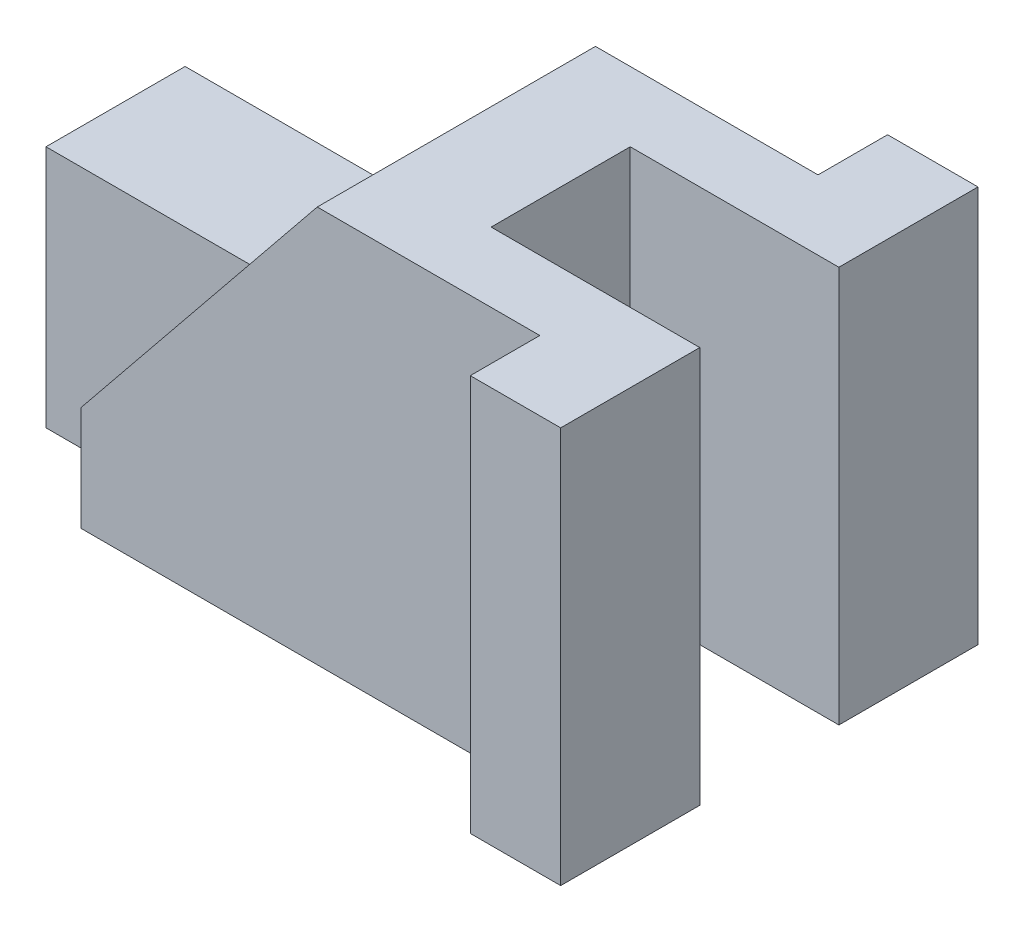
ISO-10303-21;
HEADER;
FILE_DESCRIPTION(('STEP AP214'),'2;1');
FILE_NAME('part.step','',(''),(''),'','','');
FILE_SCHEMA(('AUTOMOTIVE_DESIGN { 1 0 10303 214 1 1 1 1 }'));
ENDSEC;
DATA;
#1=APPLICATION_CONTEXT('core data for automotive mechanical design processes');
#2=APPLICATION_PROTOCOL_DEFINITION('international standard','automotive_design',2000,#1);
#3=PRODUCT_CONTEXT('',#1,'mechanical');
#4=PRODUCT('Part','Part','',(#3));
#5=PRODUCT_RELATED_PRODUCT_CATEGORY('part','',(#4));
#6=PRODUCT_DEFINITION_FORMATION('','',#4);
#7=PRODUCT_DEFINITION_CONTEXT('part definition',#1,'design');
#8=PRODUCT_DEFINITION('design','',#6,#7);
#9=PRODUCT_DEFINITION_SHAPE('','',#8);
#10=(LENGTH_UNIT() NAMED_UNIT(*) SI_UNIT(.MILLI.,.METRE.));
#11=(NAMED_UNIT(*) PLANE_ANGLE_UNIT() SI_UNIT($,.RADIAN.));
#12=(NAMED_UNIT(*) SI_UNIT($,.STERADIAN.) SOLID_ANGLE_UNIT());
#13=UNCERTAINTY_MEASURE_WITH_UNIT(LENGTH_MEASURE(1.E-05),#10,'distance_accuracy_value','');
#14=(GEOMETRIC_REPRESENTATION_CONTEXT(3) GLOBAL_UNCERTAINTY_ASSIGNED_CONTEXT((#13)) GLOBAL_UNIT_ASSIGNED_CONTEXT((#10,
#11,#12)) REPRESENTATION_CONTEXT('',''));
#15=CARTESIAN_POINT('',(0.,0.,0.));
#16=DIRECTION('',(0.,0.,1.));
#17=DIRECTION('',(1.,0.,0.));
#18=AXIS2_PLACEMENT_3D('',#15,#16,#17);
#19=CARTESIAN_POINT('',(0.,15.,20.));
#20=DIRECTION('',(1.,0.,0.));
#21=DIRECTION('',(0.,0.,-1.));
#22=AXIS2_PLACEMENT_3D('',#19,#20,#21);
#23=PLANE('',#22);
#24=DIRECTION('',(0.,1.,0.));
#25=VECTOR('',#24,1.);
#26=CARTESIAN_POINT('',(0.,0.,-10.));
#27=LINE('',#26,#25);
#28=CARTESIAN_POINT('',(0.,0.,-10.));
#29=VERTEX_POINT('',#28);
#30=CARTESIAN_POINT('',(0.,15.,-10.));
#31=VERTEX_POINT('',#30);
#32=EDGE_CURVE('E167',#29,#31,#27,.T.);
#33=ORIENTED_EDGE('',*,*,#32,.T.);
#34=DIRECTION('',(0.,0.,-1.));
#35=VECTOR('',#34,1.);
#36=CARTESIAN_POINT('',(0.,15.,20.));
#37=LINE('',#36,#35);
#38=CARTESIAN_POINT('',(0.,15.,-20.));
#39=VERTEX_POINT('',#38);
#40=EDGE_CURVE('E269',#31,#39,#37,.T.);
#41=ORIENTED_EDGE('',*,*,#40,.T.);
#42=DIRECTION('',(0.,-1.,0.));
#43=VECTOR('',#42,1.);
#44=CARTESIAN_POINT('',(0.,15.,-20.));
#45=LINE('',#44,#43);
#46=CARTESIAN_POINT('',(0.,0.,-20.));
#47=VERTEX_POINT('',#46);
#48=EDGE_CURVE('E254',#39,#47,#45,.T.);
#49=ORIENTED_EDGE('',*,*,#48,.T.);
#50=DIRECTION('',(0.,0.,-1.));
#51=VECTOR('',#50,1.);
#52=CARTESIAN_POINT('',(0.,0.,20.));
#53=LINE('',#52,#51);
#54=EDGE_CURVE('E40',#29,#47,#53,.T.);
#55=ORIENTED_EDGE('',*,*,#54,.F.);
#56=EDGE_LOOP('',(#33,#41,#49,#55));
#57=FACE_BOUND('',#56,.T.);
#58=ADVANCED_FACE('F33',(#57),#23,.F.);
#59=DIRECTION('',(0.,-1.,0.));
#60=VECTOR('',#59,1.);
#61=CARTESIAN_POINT('',(0.,0.,10.));
#62=LINE('',#61,#60);
#63=CARTESIAN_POINT('',(0.,15.,10.));
#64=VERTEX_POINT('',#63);
#65=CARTESIAN_POINT('',(0.,0.,10.));
#66=VERTEX_POINT('',#65);
#67=EDGE_CURVE('E54',#64,#66,#62,.T.);
#68=ORIENTED_EDGE('',*,*,#67,.T.);
#69=CARTESIAN_POINT('',(0.,0.,20.));
#70=VERTEX_POINT('',#69);
#71=EDGE_CURVE('E11',#70,#66,#53,.T.);
#72=ORIENTED_EDGE('',*,*,#71,.F.);
#73=DIRECTION('',(0.,-1.,0.));
#74=VECTOR('',#73,1.);
#75=CARTESIAN_POINT('',(0.,15.,20.));
#76=LINE('',#75,#74);
#77=CARTESIAN_POINT('',(0.,15.,20.));
#78=VERTEX_POINT('',#77);
#79=EDGE_CURVE('E255',#78,#70,#76,.T.);
#80=ORIENTED_EDGE('',*,*,#79,.F.);
#81=EDGE_CURVE('E280',#78,#64,#37,.T.);
#82=ORIENTED_EDGE('',*,*,#81,.T.);
#83=EDGE_LOOP('',(#68,#72,#80,#82));
#84=FACE_BOUND('',#83,.T.);
#85=ADVANCED_FACE('F341',(#84),#23,.F.);
#86=CARTESIAN_POINT('',(34.,57.,20.));
#87=DIRECTION('',(0.777244870707485,-0.629198228667965,0.));
#88=DIRECTION('',(0.629198228667965,0.777244870707485,0.));
#89=AXIS2_PLACEMENT_3D('',#86,#87,#88);
#90=PLANE('',#89);
#91=DIRECTION('',(0.629198228667965,0.777244870707485,0.));
#92=VECTOR('',#91,1.);
#93=CARTESIAN_POINT('',(23.9405178082192,44.5735808219178,-10.));
#94=LINE('',#93,#92);
#95=CARTESIAN_POINT('',(16.1904761904762,35.,-10.));
#96=VERTEX_POINT('',#95);
#97=EDGE_CURVE('E163',#31,#96,#94,.T.);
#98=ORIENTED_EDGE('',*,*,#97,.T.);
#99=DIRECTION('',(0.,0.,1.));
#100=VECTOR('',#99,1.);
#101=CARTESIAN_POINT('',(16.1904761904762,35.,10.));
#102=LINE('',#101,#100);
#103=CARTESIAN_POINT('',(16.1904761904762,35.,10.));
#104=VERTEX_POINT('',#103);
#105=EDGE_CURVE('E156',#96,#104,#102,.T.);
#106=ORIENTED_EDGE('',*,*,#105,.T.);
#107=DIRECTION('',(-0.629198228667965,-0.777244870707485,0.));
#108=VECTOR('',#107,1.);
#109=CARTESIAN_POINT('',(23.9405178082192,44.5735808219178,10.));
#110=LINE('',#109,#108);
#111=EDGE_CURVE('E160',#104,#64,#110,.T.);
#112=ORIENTED_EDGE('',*,*,#111,.T.);
#113=ORIENTED_EDGE('',*,*,#81,.F.);
#114=DIRECTION('',(-0.629198228667965,-0.777244870707485,0.));
#115=VECTOR('',#114,1.);
#116=CARTESIAN_POINT('',(34.,57.,20.));
#117=LINE('',#116,#115);
#118=CARTESIAN_POINT('',(34.,57.,20.));
#119=VERTEX_POINT('',#118);
#120=EDGE_CURVE('E267',#119,#78,#117,.T.);
#121=ORIENTED_EDGE('',*,*,#120,.F.);
#122=DIRECTION('',(0.,0.,-1.));
#123=VECTOR('',#122,1.);
#124=CARTESIAN_POINT('',(34.,57.,20.));
#125=LINE('',#124,#123);
#126=CARTESIAN_POINT('',(34.,57.,-20.));
#127=VERTEX_POINT('',#126);
#128=EDGE_CURVE('E281',#119,#127,#125,.T.);
#129=ORIENTED_EDGE('',*,*,#128,.T.);
#130=DIRECTION('',(-0.629198228667965,-0.777244870707485,0.));
#131=VECTOR('',#130,1.);
#132=CARTESIAN_POINT('',(34.,57.,-20.));
#133=LINE('',#132,#131);
#134=EDGE_CURVE('E259',#127,#39,#133,.T.);
#135=ORIENTED_EDGE('',*,*,#134,.T.);
#136=ORIENTED_EDGE('',*,*,#40,.F.);
#137=EDGE_LOOP('',(#98,#106,#112,#113,#121,#129,#135,#136));
#138=FACE_BOUND('',#137,.T.);
#139=ADVANCED_FACE('F158',(#138),#90,.F.);
#140=CARTESIAN_POINT('',(0.,0.,20.));
#141=DIRECTION('',(0.,1.,0.));
#142=DIRECTION('',(0.,0.,1.));
#143=AXIS2_PLACEMENT_3D('',#140,#141,#142);
#144=PLANE('',#143);
#145=DIRECTION('',(-1.,0.,0.));
#146=VECTOR('',#145,1.);
#147=CARTESIAN_POINT('',(79.,0.,-10.));
#148=LINE('',#147,#146);
#149=CARTESIAN_POINT('',(79.,0.,-10.));
#150=VERTEX_POINT('',#149);
#151=CARTESIAN_POINT('',(49.,0.,-10.));
#152=VERTEX_POINT('',#151);
#153=EDGE_CURVE('E201',#150,#152,#148,.T.);
#154=ORIENTED_EDGE('',*,*,#153,.T.);
#155=DIRECTION('',(0.,0.,1.));
#156=VECTOR('',#155,1.);
#157=CARTESIAN_POINT('',(49.,0.,-10.));
#158=LINE('',#157,#156);
#159=CARTESIAN_POINT('',(49.,0.,9.99999999999999));
#160=VERTEX_POINT('',#159);
#161=EDGE_CURVE('E204',#152,#160,#158,.T.);
#162=ORIENTED_EDGE('',*,*,#161,.T.);
#163=DIRECTION('',(1.,0.,0.));
#164=VECTOR('',#163,1.);
#165=CARTESIAN_POINT('',(79.,0.,10.));
#166=LINE('',#165,#164);
#167=CARTESIAN_POINT('',(79.,0.,10.));
#168=VERTEX_POINT('',#167);
#169=EDGE_CURVE('E196',#160,#168,#166,.T.);
#170=ORIENTED_EDGE('',*,*,#169,.T.);
#171=DIRECTION('',(0.,0.,-1.));
#172=VECTOR('',#171,1.);
#173=CARTESIAN_POINT('',(79.,0.,30.));
#174=LINE('',#173,#172);
#175=CARTESIAN_POINT('',(79.,0.,30.));
#176=VERTEX_POINT('',#175);
#177=EDGE_CURVE('E247',#176,#168,#174,.T.);
#178=ORIENTED_EDGE('',*,*,#177,.F.);
#179=DIRECTION('',(1.,0.,0.));
#180=VECTOR('',#179,1.);
#181=CARTESIAN_POINT('',(66.,0.,30.));
#182=LINE('',#181,#180);
#183=CARTESIAN_POINT('',(66.,0.,30.));
#184=VERTEX_POINT('',#183);
#185=EDGE_CURVE('E222',#184,#176,#182,.T.);
#186=ORIENTED_EDGE('',*,*,#185,.F.);
#187=DIRECTION('',(0.,0.,-1.));
#188=VECTOR('',#187,1.);
#189=CARTESIAN_POINT('',(66.,0.,30.));
#190=LINE('',#189,#188);
#191=CARTESIAN_POINT('',(66.,0.,20.));
#192=VERTEX_POINT('',#191);
#193=EDGE_CURVE('E251',#184,#192,#190,.T.);
#194=ORIENTED_EDGE('',*,*,#193,.T.);
#195=DIRECTION('',(1.,0.,0.));
#196=VECTOR('',#195,1.);
#197=CARTESIAN_POINT('',(0.,0.,20.));
#198=LINE('',#197,#196);
#199=EDGE_CURVE('E258',#70,#192,#198,.T.);
#200=ORIENTED_EDGE('',*,*,#199,.F.);
#201=ORIENTED_EDGE('',*,*,#71,.T.);
#202=DIRECTION('',(-1.,0.,0.));
#203=VECTOR('',#202,1.);
#204=CARTESIAN_POINT('',(79.002,0.,10.));
#205=LINE('',#204,#203);
#206=CARTESIAN_POINT('',(-15.,0.,10.));
#207=VERTEX_POINT('',#206);
#208=EDGE_CURVE('E180',#66,#207,#205,.T.);
#209=ORIENTED_EDGE('',*,*,#208,.T.);
#210=DIRECTION('',(0.,0.,-1.));
#211=VECTOR('',#210,1.);
#212=CARTESIAN_POINT('',(-15.,0.,10.));
#213=LINE('',#212,#211);
#214=CARTESIAN_POINT('',(-15.,0.,-10.));
#215=VERTEX_POINT('',#214);
#216=EDGE_CURVE('E189',#207,#215,#213,.T.);
#217=ORIENTED_EDGE('',*,*,#216,.T.);
#218=DIRECTION('',(-1.,0.,0.));
#219=VECTOR('',#218,1.);
#220=CARTESIAN_POINT('',(79.002,0.,-10.));
#221=LINE('',#220,#219);
#222=EDGE_CURVE('E183',#29,#215,#221,.T.);
#223=ORIENTED_EDGE('',*,*,#222,.F.);
#224=ORIENTED_EDGE('',*,*,#54,.T.);
#225=DIRECTION('',(1.,0.,0.));
#226=VECTOR('',#225,1.);
#227=CARTESIAN_POINT('',(0.,0.,-20.));
#228=LINE('',#227,#226);
#229=CARTESIAN_POINT('',(66.,0.,-20.));
#230=VERTEX_POINT('',#229);
#231=EDGE_CURVE('E271',#47,#230,#228,.T.);
#232=ORIENTED_EDGE('',*,*,#231,.T.);
#233=CARTESIAN_POINT('',(66.,0.,-30.));
#234=VERTEX_POINT('',#233);
#235=EDGE_CURVE('E250',#230,#234,#190,.T.);
#236=ORIENTED_EDGE('',*,*,#235,.T.);
#237=DIRECTION('',(1.,0.,0.));
#238=VECTOR('',#237,1.);
#239=CARTESIAN_POINT('',(66.,0.,-30.));
#240=LINE('',#239,#238);
#241=CARTESIAN_POINT('',(79.,0.,-30.));
#242=VERTEX_POINT('',#241);
#243=EDGE_CURVE('E232',#234,#242,#240,.T.);
#244=ORIENTED_EDGE('',*,*,#243,.T.);
#245=EDGE_CURVE('E246',#150,#242,#174,.T.);
#246=ORIENTED_EDGE('',*,*,#245,.F.);
#247=EDGE_LOOP('',(#154,#162,#170,#178,#186,#194,#200,#201,#209,#217,#223,#224,#232,#236,#244,#246));
#248=FACE_BOUND('',#247,.T.);
#249=ADVANCED_FACE('F289',(#248),#144,.F.);
#250=CARTESIAN_POINT('',(66.,57.,20.));
#251=DIRECTION('',(0.,-1.,0.));
#252=DIRECTION('',(1.,0.,0.));
#253=AXIS2_PLACEMENT_3D('',#250,#251,#252);
#254=PLANE('',#253);
#255=DIRECTION('',(-1.,0.,0.));
#256=VECTOR('',#255,1.);
#257=CARTESIAN_POINT('',(79.,57.,-10.));
#258=LINE('',#257,#256);
#259=CARTESIAN_POINT('',(79.,57.,-10.));
#260=VERTEX_POINT('',#259);
#261=CARTESIAN_POINT('',(49.,57.,-10.));
#262=VERTEX_POINT('',#261);
#263=EDGE_CURVE('E193',#260,#262,#258,.T.);
#264=ORIENTED_EDGE('',*,*,#263,.F.);
#265=DIRECTION('',(0.,0.,-1.));
#266=VECTOR('',#265,1.);
#267=CARTESIAN_POINT('',(79.,57.,30.));
#268=LINE('',#267,#266);
#269=CARTESIAN_POINT('',(79.,57.,-30.));
#270=VERTEX_POINT('',#269);
#271=EDGE_CURVE('E242',#260,#270,#268,.T.);
#272=ORIENTED_EDGE('',*,*,#271,.T.);
#273=DIRECTION('',(-1.,0.,0.));
#274=VECTOR('',#273,1.);
#275=CARTESIAN_POINT('',(66.,57.,-30.));
#276=LINE('',#275,#274);
#277=CARTESIAN_POINT('',(66.,57.,-30.));
#278=VERTEX_POINT('',#277);
#279=EDGE_CURVE('E223',#270,#278,#276,.T.);
#280=ORIENTED_EDGE('',*,*,#279,.T.);
#281=DIRECTION('',(0.,0.,-1.));
#282=VECTOR('',#281,1.);
#283=CARTESIAN_POINT('',(66.,57.,30.));
#284=LINE('',#283,#282);
#285=CARTESIAN_POINT('',(66.,57.,-20.));
#286=VERTEX_POINT('',#285);
#287=EDGE_CURVE('E229',#286,#278,#284,.T.);
#288=ORIENTED_EDGE('',*,*,#287,.F.);
#289=DIRECTION('',(-1.,0.,0.));
#290=VECTOR('',#289,1.);
#291=CARTESIAN_POINT('',(66.,57.,-20.));
#292=LINE('',#291,#290);
#293=EDGE_CURVE('E276',#286,#127,#292,.T.);
#294=ORIENTED_EDGE('',*,*,#293,.T.);
#295=ORIENTED_EDGE('',*,*,#128,.F.);
#296=DIRECTION('',(-1.,0.,0.));
#297=VECTOR('',#296,1.);
#298=CARTESIAN_POINT('',(66.,57.,20.));
#299=LINE('',#298,#297);
#300=CARTESIAN_POINT('',(66.,57.,20.));
#301=VERTEX_POINT('',#300);
#302=EDGE_CURVE('E265',#301,#119,#299,.T.);
#303=ORIENTED_EDGE('',*,*,#302,.F.);
#304=CARTESIAN_POINT('',(66.,57.,30.));
#305=VERTEX_POINT('',#304);
#306=EDGE_CURVE('E240',#305,#301,#284,.T.);
#307=ORIENTED_EDGE('',*,*,#306,.F.);
#308=DIRECTION('',(-1.,0.,0.));
#309=VECTOR('',#308,1.);
#310=CARTESIAN_POINT('',(66.,57.,30.));
#311=LINE('',#310,#309);
#312=CARTESIAN_POINT('',(79.,57.,30.));
#313=VERTEX_POINT('',#312);
#314=EDGE_CURVE('E227',#313,#305,#311,.T.);
#315=ORIENTED_EDGE('',*,*,#314,.F.);
#316=CARTESIAN_POINT('',(79.,57.,10.));
#317=VERTEX_POINT('',#316);
#318=EDGE_CURVE('E243',#313,#317,#268,.T.);
#319=ORIENTED_EDGE('',*,*,#318,.T.);
#320=DIRECTION('',(1.,0.,0.));
#321=VECTOR('',#320,1.);
#322=CARTESIAN_POINT('',(79.,57.,10.));
#323=LINE('',#322,#321);
#324=CARTESIAN_POINT('',(49.,57.,9.99999999999999));
#325=VERTEX_POINT('',#324);
#326=EDGE_CURVE('E198',#325,#317,#323,.T.);
#327=ORIENTED_EDGE('',*,*,#326,.F.);
#328=DIRECTION('',(0.,0.,1.));
#329=VECTOR('',#328,1.);
#330=CARTESIAN_POINT('',(49.,57.,-10.));
#331=LINE('',#330,#329);
#332=EDGE_CURVE('E195',#262,#325,#331,.T.);
#333=ORIENTED_EDGE('',*,*,#332,.F.);
#334=EDGE_LOOP('',(#264,#272,#280,#288,#294,#295,#303,#307,#315,#319,#327,#333));
#335=FACE_BOUND('',#334,.T.);
#336=ADVANCED_FACE('F299',(#335),#254,.F.);
#337=CARTESIAN_POINT('',(79.,0.,30.));
#338=DIRECTION('',(-1.,0.,0.));
#339=DIRECTION('',(0.,0.,1.));
#340=AXIS2_PLACEMENT_3D('',#337,#338,#339);
#341=PLANE('',#340);
#342=DIRECTION('',(0.,-1.,0.));
#343=VECTOR('',#342,1.);
#344=CARTESIAN_POINT('',(79.,57.,-10.));
#345=LINE('',#344,#343);
#346=EDGE_CURVE('E215',#260,#150,#345,.T.);
#347=ORIENTED_EDGE('',*,*,#346,.T.);
#348=ORIENTED_EDGE('',*,*,#245,.T.);
#349=DIRECTION('',(0.,1.,0.));
#350=VECTOR('',#349,1.);
#351=CARTESIAN_POINT('',(79.,0.,-30.));
#352=LINE('',#351,#350);
#353=EDGE_CURVE('E235',#242,#270,#352,.T.);
#354=ORIENTED_EDGE('',*,*,#353,.T.);
#355=ORIENTED_EDGE('',*,*,#271,.F.);
#356=EDGE_LOOP('',(#347,#348,#354,#355));
#357=FACE_BOUND('',#356,.T.);
#358=ADVANCED_FACE('F312',(#357),#341,.F.);
#359=DIRECTION('',(0.,-1.,0.));
#360=VECTOR('',#359,1.);
#361=CARTESIAN_POINT('',(79.,57.,10.));
#362=LINE('',#361,#360);
#363=EDGE_CURVE('E200',#317,#168,#362,.T.);
#364=ORIENTED_EDGE('',*,*,#363,.F.);
#365=ORIENTED_EDGE('',*,*,#318,.F.);
#366=DIRECTION('',(0.,1.,0.));
#367=VECTOR('',#366,1.);
#368=CARTESIAN_POINT('',(79.,0.,30.));
#369=LINE('',#368,#367);
#370=EDGE_CURVE('E225',#176,#313,#369,.T.);
#371=ORIENTED_EDGE('',*,*,#370,.F.);
#372=ORIENTED_EDGE('',*,*,#177,.T.);
#373=EDGE_LOOP('',(#364,#365,#371,#372));
#374=FACE_BOUND('',#373,.T.);
#375=ADVANCED_FACE('F329',(#374),#341,.F.);
#376=CARTESIAN_POINT('',(0.,0.,20.));
#377=DIRECTION('',(0.,0.,1.));
#378=DIRECTION('',(1.,0.,0.));
#379=AXIS2_PLACEMENT_3D('',#376,#377,#378);
#380=PLANE('',#379);
#381=ORIENTED_EDGE('',*,*,#79,.T.);
#382=ORIENTED_EDGE('',*,*,#199,.T.);
#383=DIRECTION('',(0.,1.,0.));
#384=VECTOR('',#383,1.);
#385=CARTESIAN_POINT('',(66.,0.,20.));
#386=LINE('',#385,#384);
#387=EDGE_CURVE('E262',#192,#301,#386,.T.);
#388=ORIENTED_EDGE('',*,*,#387,.T.);
#389=ORIENTED_EDGE('',*,*,#302,.T.);
#390=ORIENTED_EDGE('',*,*,#120,.T.);
#391=EDGE_LOOP('',(#381,#382,#388,#389,#390));
#392=FACE_BOUND('',#391,.T.);
#393=ADVANCED_FACE('F339',(#392),#380,.T.);
#394=CARTESIAN_POINT('',(0.,0.,-20.));
#395=DIRECTION('',(0.,0.,1.));
#396=DIRECTION('',(1.,0.,0.));
#397=AXIS2_PLACEMENT_3D('',#394,#395,#396);
#398=PLANE('',#397);
#399=ORIENTED_EDGE('',*,*,#48,.F.);
#400=ORIENTED_EDGE('',*,*,#134,.F.);
#401=ORIENTED_EDGE('',*,*,#293,.F.);
#402=DIRECTION('',(0.,1.,0.));
#403=VECTOR('',#402,1.);
#404=CARTESIAN_POINT('',(66.,0.,-20.));
#405=LINE('',#404,#403);
#406=EDGE_CURVE('E274',#230,#286,#405,.T.);
#407=ORIENTED_EDGE('',*,*,#406,.F.);
#408=ORIENTED_EDGE('',*,*,#231,.F.);
#409=EDGE_LOOP('',(#399,#400,#401,#407,#408));
#410=FACE_BOUND('',#409,.T.);
#411=ADVANCED_FACE('F294',(#410),#398,.F.);
#412=CARTESIAN_POINT('',(66.,0.,30.));
#413=DIRECTION('',(1.,0.,0.));
#414=DIRECTION('',(0.,0.,-1.));
#415=AXIS2_PLACEMENT_3D('',#412,#413,#414);
#416=PLANE('',#415);
#417=ORIENTED_EDGE('',*,*,#235,.F.);
#418=ORIENTED_EDGE('',*,*,#406,.T.);
#419=ORIENTED_EDGE('',*,*,#287,.T.);
#420=DIRECTION('',(0.,-1.,0.));
#421=VECTOR('',#420,1.);
#422=CARTESIAN_POINT('',(66.,0.,-30.));
#423=LINE('',#422,#421);
#424=EDGE_CURVE('E218',#278,#234,#423,.T.);
#425=ORIENTED_EDGE('',*,*,#424,.T.);
#426=EDGE_LOOP('',(#417,#418,#419,#425));
#427=FACE_BOUND('',#426,.T.);
#428=ADVANCED_FACE('F304',(#427),#416,.F.);
#429=ORIENTED_EDGE('',*,*,#387,.F.);
#430=ORIENTED_EDGE('',*,*,#193,.F.);
#431=DIRECTION('',(0.,-1.,0.));
#432=VECTOR('',#431,1.);
#433=CARTESIAN_POINT('',(66.,0.,30.));
#434=LINE('',#433,#432);
#435=EDGE_CURVE('E219',#305,#184,#434,.T.);
#436=ORIENTED_EDGE('',*,*,#435,.F.);
#437=ORIENTED_EDGE('',*,*,#306,.T.);
#438=EDGE_LOOP('',(#429,#430,#436,#437));
#439=FACE_BOUND('',#438,.T.);
#440=ADVANCED_FACE('F388',(#439),#416,.F.);
#441=CARTESIAN_POINT('',(0.,0.,30.));
#442=DIRECTION('',(0.,0.,-1.));
#443=DIRECTION('',(-1.,0.,0.));
#444=AXIS2_PLACEMENT_3D('',#441,#442,#443);
#445=PLANE('',#444);
#446=ORIENTED_EDGE('',*,*,#435,.T.);
#447=ORIENTED_EDGE('',*,*,#185,.T.);
#448=ORIENTED_EDGE('',*,*,#370,.T.);
#449=ORIENTED_EDGE('',*,*,#314,.T.);
#450=EDGE_LOOP('',(#446,#447,#448,#449));
#451=FACE_BOUND('',#450,.T.);
#452=ADVANCED_FACE('F333',(#451),#445,.F.);
#453=CARTESIAN_POINT('',(0.,0.,-30.));
#454=DIRECTION('',(0.,0.,-1.));
#455=DIRECTION('',(-1.,0.,0.));
#456=AXIS2_PLACEMENT_3D('',#453,#454,#455);
#457=PLANE('',#456);
#458=ORIENTED_EDGE('',*,*,#424,.F.);
#459=ORIENTED_EDGE('',*,*,#279,.F.);
#460=ORIENTED_EDGE('',*,*,#353,.F.);
#461=ORIENTED_EDGE('',*,*,#243,.F.);
#462=EDGE_LOOP('',(#458,#459,#460,#461));
#463=FACE_BOUND('',#462,.T.);
#464=ADVANCED_FACE('F309',(#463),#457,.T.);
#465=CARTESIAN_POINT('',(79.,57.,-10.));
#466=DIRECTION('',(0.,0.,1.));
#467=DIRECTION('',(1.,0.,0.));
#468=AXIS2_PLACEMENT_3D('',#465,#466,#467);
#469=PLANE('',#468);
#470=ORIENTED_EDGE('',*,*,#153,.F.);
#471=ORIENTED_EDGE('',*,*,#346,.F.);
#472=ORIENTED_EDGE('',*,*,#263,.T.);
#473=DIRECTION('',(0.,-1.,0.));
#474=VECTOR('',#473,1.);
#475=CARTESIAN_POINT('',(49.,57.,-10.));
#476=LINE('',#475,#474);
#477=EDGE_CURVE('E213',#262,#152,#476,.T.);
#478=ORIENTED_EDGE('',*,*,#477,.T.);
#479=EDGE_LOOP('',(#470,#471,#472,#478));
#480=FACE_BOUND('',#479,.T.);
#481=ADVANCED_FACE('F315',(#480),#469,.T.);
#482=CARTESIAN_POINT('',(49.,57.,-10.));
#483=DIRECTION('',(1.,0.,0.));
#484=DIRECTION('',(0.,0.,-1.));
#485=AXIS2_PLACEMENT_3D('',#482,#483,#484);
#486=PLANE('',#485);
#487=ORIENTED_EDGE('',*,*,#161,.F.);
#488=ORIENTED_EDGE('',*,*,#477,.F.);
#489=ORIENTED_EDGE('',*,*,#332,.T.);
#490=DIRECTION('',(0.,-1.,0.));
#491=VECTOR('',#490,1.);
#492=CARTESIAN_POINT('',(49.,57.,9.99999999999999));
#493=LINE('',#492,#491);
#494=EDGE_CURVE('E211',#325,#160,#493,.T.);
#495=ORIENTED_EDGE('',*,*,#494,.T.);
#496=EDGE_LOOP('',(#487,#488,#489,#495));
#497=FACE_BOUND('',#496,.T.);
#498=ADVANCED_FACE('F319',(#497),#486,.T.);
#499=CARTESIAN_POINT('',(79.,57.,10.));
#500=DIRECTION('',(0.,0.,-1.));
#501=DIRECTION('',(-1.,0.,0.));
#502=AXIS2_PLACEMENT_3D('',#499,#500,#501);
#503=PLANE('',#502);
#504=ORIENTED_EDGE('',*,*,#169,.F.);
#505=ORIENTED_EDGE('',*,*,#494,.F.);
#506=ORIENTED_EDGE('',*,*,#326,.T.);
#507=ORIENTED_EDGE('',*,*,#363,.T.);
#508=EDGE_LOOP('',(#504,#505,#506,#507));
#509=FACE_BOUND('',#508,.T.);
#510=ADVANCED_FACE('F324',(#509),#503,.T.);
#511=CARTESIAN_POINT('',(79.002,35.,10.));
#512=DIRECTION('',(0.,-1.,0.));
#513=DIRECTION('',(0.,0.,-1.));
#514=AXIS2_PLACEMENT_3D('',#511,#512,#513);
#515=PLANE('',#514);
#516=ORIENTED_EDGE('',*,*,#105,.F.);
#517=DIRECTION('',(-1.,0.,0.));
#518=VECTOR('',#517,1.);
#519=CARTESIAN_POINT('',(79.002,35.,-10.));
#520=LINE('',#519,#518);
#521=CARTESIAN_POINT('',(-15.,35.,-10.));
#522=VERTEX_POINT('',#521);
#523=EDGE_CURVE('E181',#96,#522,#520,.T.);
#524=ORIENTED_EDGE('',*,*,#523,.T.);
#525=DIRECTION('',(0.,0.,1.));
#526=VECTOR('',#525,1.);
#527=CARTESIAN_POINT('',(-15.,35.,10.));
#528=LINE('',#527,#526);
#529=CARTESIAN_POINT('',(-15.,35.,10.));
#530=VERTEX_POINT('',#529);
#531=EDGE_CURVE('E178',#522,#530,#528,.T.);
#532=ORIENTED_EDGE('',*,*,#531,.T.);
#533=DIRECTION('',(-1.,0.,0.));
#534=VECTOR('',#533,1.);
#535=CARTESIAN_POINT('',(79.002,35.,10.));
#536=LINE('',#535,#534);
#537=EDGE_CURVE('E172',#104,#530,#536,.T.);
#538=ORIENTED_EDGE('',*,*,#537,.F.);
#539=EDGE_LOOP('',(#516,#524,#532,#538));
#540=FACE_BOUND('',#539,.T.);
#541=ADVANCED_FACE('F176',(#540),#515,.F.);
#542=CARTESIAN_POINT('',(79.002,0.,-10.));
#543=DIRECTION('',(0.,0.,1.));
#544=DIRECTION('',(1.,0.,0.));
#545=AXIS2_PLACEMENT_3D('',#542,#543,#544);
#546=PLANE('',#545);
#547=ORIENTED_EDGE('',*,*,#97,.F.);
#548=ORIENTED_EDGE('',*,*,#32,.F.);
#549=ORIENTED_EDGE('',*,*,#222,.T.);
#550=DIRECTION('',(0.,1.,0.));
#551=VECTOR('',#550,1.);
#552=CARTESIAN_POINT('',(-15.,0.,-10.));
#553=LINE('',#552,#551);
#554=EDGE_CURVE('E205',#215,#522,#553,.T.);
#555=ORIENTED_EDGE('',*,*,#554,.T.);
#556=ORIENTED_EDGE('',*,*,#523,.F.);
#557=EDGE_LOOP('',(#547,#548,#549,#555,#556));
#558=FACE_BOUND('',#557,.T.);
#559=ADVANCED_FACE('F352',(#558),#546,.F.);
#560=CARTESIAN_POINT('',(-15.,0.,0.));
#561=DIRECTION('',(-1.,0.,0.));
#562=DIRECTION('',(0.,0.,1.));
#563=AXIS2_PLACEMENT_3D('',#560,#561,#562);
#564=PLANE('',#563);
#565=ORIENTED_EDGE('',*,*,#554,.F.);
#566=ORIENTED_EDGE('',*,*,#216,.F.);
#567=DIRECTION('',(0.,-1.,0.));
#568=VECTOR('',#567,1.);
#569=CARTESIAN_POINT('',(-15.,0.,10.));
#570=LINE('',#569,#568);
#571=EDGE_CURVE('E342',#530,#207,#570,.T.);
#572=ORIENTED_EDGE('',*,*,#571,.F.);
#573=ORIENTED_EDGE('',*,*,#531,.F.);
#574=EDGE_LOOP('',(#565,#566,#572,#573));
#575=FACE_BOUND('',#574,.T.);
#576=ADVANCED_FACE('F347',(#575),#564,.T.);
#577=CARTESIAN_POINT('',(79.002,0.,10.));
#578=DIRECTION('',(0.,0.,-1.));
#579=DIRECTION('',(-1.,0.,0.));
#580=AXIS2_PLACEMENT_3D('',#577,#578,#579);
#581=PLANE('',#580);
#582=ORIENTED_EDGE('',*,*,#111,.F.);
#583=ORIENTED_EDGE('',*,*,#537,.T.);
#584=ORIENTED_EDGE('',*,*,#571,.T.);
#585=ORIENTED_EDGE('',*,*,#208,.F.);
#586=ORIENTED_EDGE('',*,*,#67,.F.);
#587=EDGE_LOOP('',(#582,#583,#584,#585,#586));
#588=FACE_BOUND('',#587,.T.);
#589=ADVANCED_FACE('F170',(#588),#581,.F.);
#590=CLOSED_SHELL('',(#58,#85,#139,#249,#336,#358,#375,#393,#411,#428,#440,#452,#464,#481,#498,
#510,#541,#559,#576,#589));
#591=MANIFOLD_SOLID_BREP('B2',#590);
#592=ADVANCED_BREP_SHAPE_REPRESENTATION('',(#18,#591),#14);
#593=SHAPE_DEFINITION_REPRESENTATION(#9,#592);
ENDSEC;
END-ISO-10303-21;
